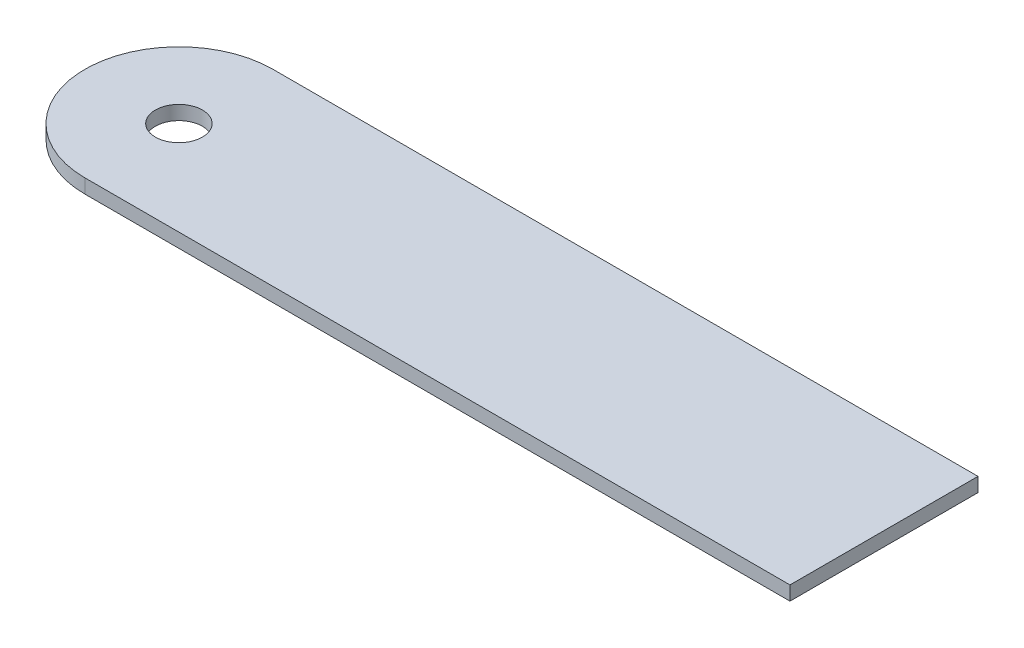
ISO-10303-21;
HEADER;
FILE_DESCRIPTION(('STEP AP214'),'2;1');
FILE_NAME('part.step','',(''),(''),'','','');
FILE_SCHEMA(('AUTOMOTIVE_DESIGN { 1 0 10303 214 1 1 1 1 }'));
ENDSEC;
DATA;
#1=APPLICATION_CONTEXT('core data for automotive mechanical design processes');
#2=APPLICATION_PROTOCOL_DEFINITION('international standard','automotive_design',2000,#1);
#3=PRODUCT_CONTEXT('',#1,'mechanical');
#4=PRODUCT('Part','Part','',(#3));
#5=PRODUCT_RELATED_PRODUCT_CATEGORY('part','',(#4));
#6=PRODUCT_DEFINITION_FORMATION('','',#4);
#7=PRODUCT_DEFINITION_CONTEXT('part definition',#1,'design');
#8=PRODUCT_DEFINITION('design','',#6,#7);
#9=PRODUCT_DEFINITION_SHAPE('','',#8);
#10=(LENGTH_UNIT() NAMED_UNIT(*) SI_UNIT(.MILLI.,.METRE.));
#11=(NAMED_UNIT(*) PLANE_ANGLE_UNIT() SI_UNIT($,.RADIAN.));
#12=(NAMED_UNIT(*) SI_UNIT($,.STERADIAN.) SOLID_ANGLE_UNIT());
#13=UNCERTAINTY_MEASURE_WITH_UNIT(LENGTH_MEASURE(1.E-05),#10,'distance_accuracy_value','');
#14=(GEOMETRIC_REPRESENTATION_CONTEXT(3) GLOBAL_UNCERTAINTY_ASSIGNED_CONTEXT((#13)) GLOBAL_UNIT_ASSIGNED_CONTEXT((#10,
#11,#12)) REPRESENTATION_CONTEXT('',''));
#15=CARTESIAN_POINT('',(0.,0.,0.));
#16=DIRECTION('',(0.,0.,1.));
#17=DIRECTION('',(1.,0.,0.));
#18=AXIS2_PLACEMENT_3D('',#15,#16,#17);
#19=CARTESIAN_POINT('',(-75.,3.,0.));
#20=DIRECTION('',(0.,-1.,0.));
#21=DIRECTION('',(0.,0.,-1.));
#22=AXIS2_PLACEMENT_3D('',#19,#20,#21);
#23=CYLINDRICAL_SURFACE('',#22,20.);
#24=CARTESIAN_POINT('',(-75.,0.,0.));
#25=DIRECTION('',(0.,1.,0.));
#26=DIRECTION('',(0.,0.,1.));
#27=AXIS2_PLACEMENT_3D('',#24,#25,#26);
#28=CIRCLE('',#27,20.);
#29=CARTESIAN_POINT('',(-75.,0.,-20.));
#30=VERTEX_POINT('',#29);
#31=CARTESIAN_POINT('',(-75.,0.,20.));
#32=VERTEX_POINT('',#31);
#33=EDGE_CURVE('E104',#30,#32,#28,.T.);
#34=ORIENTED_EDGE('',*,*,#33,.T.);
#35=DIRECTION('',(0.,-1.,0.));
#36=VECTOR('',#35,1.);
#37=CARTESIAN_POINT('',(-75.,3.,20.));
#38=LINE('',#37,#36);
#39=CARTESIAN_POINT('',(-75.,3.,20.));
#40=VERTEX_POINT('',#39);
#41=EDGE_CURVE('E11',#40,#32,#38,.T.);
#42=ORIENTED_EDGE('',*,*,#41,.F.);
#43=CARTESIAN_POINT('',(-75.,3.,0.));
#44=DIRECTION('',(0.,1.,0.));
#45=DIRECTION('',(0.,0.,1.));
#46=AXIS2_PLACEMENT_3D('',#43,#44,#45);
#47=CIRCLE('',#46,20.);
#48=CARTESIAN_POINT('',(-75.,3.,-20.));
#49=VERTEX_POINT('',#48);
#50=EDGE_CURVE('E87',#49,#40,#47,.T.);
#51=ORIENTED_EDGE('',*,*,#50,.F.);
#52=DIRECTION('',(0.,-1.,0.));
#53=VECTOR('',#52,1.);
#54=CARTESIAN_POINT('',(-75.,3.,-20.));
#55=LINE('',#54,#53);
#56=EDGE_CURVE('E54',#49,#30,#55,.T.);
#57=ORIENTED_EDGE('',*,*,#56,.T.);
#58=EDGE_LOOP('',(#34,#42,#51,#57));
#59=FACE_BOUND('',#58,.T.);
#60=ADVANCED_FACE('F37',(#59),#23,.T.);
#61=CARTESIAN_POINT('',(0.,3.,20.));
#62=DIRECTION('',(0.,0.,-1.));
#63=DIRECTION('',(-1.,0.,0.));
#64=AXIS2_PLACEMENT_3D('',#61,#62,#63);
#65=PLANE('',#64);
#66=DIRECTION('',(1.,0.,0.));
#67=VECTOR('',#66,1.);
#68=CARTESIAN_POINT('',(0.,0.,20.));
#69=LINE('',#68,#67);
#70=CARTESIAN_POINT('',(75.,0.,20.));
#71=VERTEX_POINT('',#70);
#72=EDGE_CURVE('E92',#32,#71,#69,.T.);
#73=ORIENTED_EDGE('',*,*,#72,.T.);
#74=DIRECTION('',(0.,-1.,0.));
#75=VECTOR('',#74,1.);
#76=CARTESIAN_POINT('',(75.,3.,20.));
#77=LINE('',#76,#75);
#78=CARTESIAN_POINT('',(75.,3.,20.));
#79=VERTEX_POINT('',#78);
#80=EDGE_CURVE('E46',#79,#71,#77,.T.);
#81=ORIENTED_EDGE('',*,*,#80,.F.);
#82=DIRECTION('',(1.,0.,0.));
#83=VECTOR('',#82,1.);
#84=CARTESIAN_POINT('',(0.,3.,20.));
#85=LINE('',#84,#83);
#86=EDGE_CURVE('E80',#40,#79,#85,.T.);
#87=ORIENTED_EDGE('',*,*,#86,.F.);
#88=ORIENTED_EDGE('',*,*,#41,.T.);
#89=EDGE_LOOP('',(#73,#81,#87,#88));
#90=FACE_BOUND('',#89,.T.);
#91=ADVANCED_FACE('F91',(#90),#65,.F.);
#92=CARTESIAN_POINT('',(75.,3.,0.));
#93=DIRECTION('',(-1.,0.,0.));
#94=DIRECTION('',(0.,0.,1.));
#95=AXIS2_PLACEMENT_3D('',#92,#93,#94);
#96=PLANE('',#95);
#97=DIRECTION('',(0.,0.,-1.));
#98=VECTOR('',#97,1.);
#99=CARTESIAN_POINT('',(75.,0.,0.));
#100=LINE('',#99,#98);
#101=CARTESIAN_POINT('',(75.,0.,-20.));
#102=VERTEX_POINT('',#101);
#103=EDGE_CURVE('E107',#71,#102,#100,.T.);
#104=ORIENTED_EDGE('',*,*,#103,.T.);
#105=DIRECTION('',(0.,-1.,0.));
#106=VECTOR('',#105,1.);
#107=CARTESIAN_POINT('',(75.,3.,-20.));
#108=LINE('',#107,#106);
#109=CARTESIAN_POINT('',(75.,3.,-20.));
#110=VERTEX_POINT('',#109);
#111=EDGE_CURVE('E69',#110,#102,#108,.T.);
#112=ORIENTED_EDGE('',*,*,#111,.F.);
#113=DIRECTION('',(0.,0.,-1.));
#114=VECTOR('',#113,1.);
#115=CARTESIAN_POINT('',(75.,3.,0.));
#116=LINE('',#115,#114);
#117=EDGE_CURVE('E86',#79,#110,#116,.T.);
#118=ORIENTED_EDGE('',*,*,#117,.F.);
#119=ORIENTED_EDGE('',*,*,#80,.T.);
#120=EDGE_LOOP('',(#104,#112,#118,#119));
#121=FACE_BOUND('',#120,.T.);
#122=ADVANCED_FACE('F95',(#121),#96,.F.);
#123=CARTESIAN_POINT('',(-75.,3.,0.));
#124=DIRECTION('',(0.,-1.,0.));
#125=DIRECTION('',(0.,0.,-1.));
#126=AXIS2_PLACEMENT_3D('',#123,#124,#125);
#127=CYLINDRICAL_SURFACE('',#126,5.);
#128=CARTESIAN_POINT('',(-75.,3.,0.));
#129=DIRECTION('',(0.,1.,0.));
#130=DIRECTION('',(0.,0.,1.));
#131=AXIS2_PLACEMENT_3D('',#128,#129,#130);
#132=CIRCLE('',#131,5.);
#133=CARTESIAN_POINT('',(-75.,3.,5.00000000000001));
#134=VERTEX_POINT('',#133);
#135=EDGE_CURVE('E112',#134,#134,#132,.T.);
#136=ORIENTED_EDGE('',*,*,#135,.T.);
#137=EDGE_LOOP('',(#136));
#138=FACE_BOUND('',#137,.T.);
#139=CARTESIAN_POINT('',(-75.,0.,0.));
#140=DIRECTION('',(0.,1.,0.));
#141=DIRECTION('',(0.,0.,1.));
#142=AXIS2_PLACEMENT_3D('',#139,#140,#141);
#143=CIRCLE('',#142,5.);
#144=CARTESIAN_POINT('',(-75.,0.,5.00000000000001));
#145=VERTEX_POINT('',#144);
#146=EDGE_CURVE('E101',#145,#145,#143,.T.);
#147=ORIENTED_EDGE('',*,*,#146,.F.);
#148=EDGE_LOOP('',(#147));
#149=FACE_BOUND('',#148,.T.);
#150=ADVANCED_FACE('F39',(#138,#149),#127,.F.);
#151=CARTESIAN_POINT('',(0.,3.,-20.));
#152=DIRECTION('',(0.,0.,-1.));
#153=DIRECTION('',(-1.,0.,0.));
#154=AXIS2_PLACEMENT_3D('',#151,#152,#153);
#155=PLANE('',#154);
#156=DIRECTION('',(1.,0.,0.));
#157=VECTOR('',#156,1.);
#158=CARTESIAN_POINT('',(0.,0.,-20.));
#159=LINE('',#158,#157);
#160=EDGE_CURVE('E109',#30,#102,#159,.T.);
#161=ORIENTED_EDGE('',*,*,#160,.F.);
#162=ORIENTED_EDGE('',*,*,#56,.F.);
#163=DIRECTION('',(1.,0.,0.));
#164=VECTOR('',#163,1.);
#165=CARTESIAN_POINT('',(0.,3.,-20.));
#166=LINE('',#165,#164);
#167=EDGE_CURVE('E96',#49,#110,#166,.T.);
#168=ORIENTED_EDGE('',*,*,#167,.T.);
#169=ORIENTED_EDGE('',*,*,#111,.T.);
#170=EDGE_LOOP('',(#161,#162,#168,#169));
#171=FACE_BOUND('',#170,.T.);
#172=ADVANCED_FACE('F123',(#171),#155,.T.);
#173=CARTESIAN_POINT('',(0.,3.,0.));
#174=DIRECTION('',(0.,1.,0.));
#175=DIRECTION('',(0.,0.,1.));
#176=AXIS2_PLACEMENT_3D('',#173,#174,#175);
#177=PLANE('',#176);
#178=ORIENTED_EDGE('',*,*,#135,.F.);
#179=EDGE_LOOP('',(#178));
#180=FACE_BOUND('',#179,.T.);
#181=ORIENTED_EDGE('',*,*,#50,.T.);
#182=ORIENTED_EDGE('',*,*,#86,.T.);
#183=ORIENTED_EDGE('',*,*,#117,.T.);
#184=ORIENTED_EDGE('',*,*,#167,.F.);
#185=EDGE_LOOP('',(#181,#182,#183,#184));
#186=FACE_BOUND('',#185,.T.);
#187=ADVANCED_FACE('F83',(#180,#186),#177,.T.);
#188=CARTESIAN_POINT('',(0.,0.,0.));
#189=DIRECTION('',(0.,1.,0.));
#190=DIRECTION('',(0.,0.,1.));
#191=AXIS2_PLACEMENT_3D('',#188,#189,#190);
#192=PLANE('',#191);
#193=ORIENTED_EDGE('',*,*,#146,.T.);
#194=EDGE_LOOP('',(#193));
#195=FACE_BOUND('',#194,.T.);
#196=ORIENTED_EDGE('',*,*,#33,.F.);
#197=ORIENTED_EDGE('',*,*,#160,.T.);
#198=ORIENTED_EDGE('',*,*,#103,.F.);
#199=ORIENTED_EDGE('',*,*,#72,.F.);
#200=EDGE_LOOP('',(#196,#197,#198,#199));
#201=FACE_BOUND('',#200,.T.);
#202=ADVANCED_FACE('F122',(#195,#201),#192,.F.);
#203=CLOSED_SHELL('',(#60,#91,#122,#150,#172,#187,#202));
#204=MANIFOLD_SOLID_BREP('B2',#203);
#205=ADVANCED_BREP_SHAPE_REPRESENTATION('',(#18,#204),#14);
#206=SHAPE_DEFINITION_REPRESENTATION(#9,#205);
ENDSEC;
END-ISO-10303-21;
